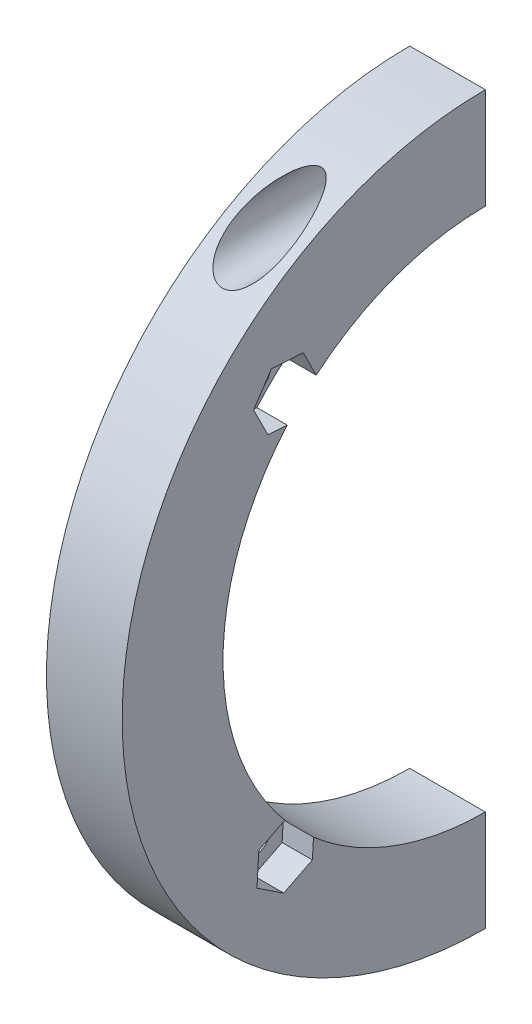
ISO-10303-21;
HEADER;
FILE_DESCRIPTION(('STEP AP214'),'2;1');
FILE_NAME('part.step','',(''),(''),'','','');
FILE_SCHEMA(('AUTOMOTIVE_DESIGN { 1 0 10303 214 1 1 1 1 }'));
ENDSEC;
DATA;
#1=APPLICATION_CONTEXT('core data for automotive mechanical design processes');
#2=APPLICATION_PROTOCOL_DEFINITION('international standard','automotive_design',2000,#1);
#3=PRODUCT_CONTEXT('',#1,'mechanical');
#4=PRODUCT('Part','Part','',(#3));
#5=PRODUCT_RELATED_PRODUCT_CATEGORY('part','',(#4));
#6=PRODUCT_DEFINITION_FORMATION('','',#4);
#7=PRODUCT_DEFINITION_CONTEXT('part definition',#1,'design');
#8=PRODUCT_DEFINITION('design','',#6,#7);
#9=PRODUCT_DEFINITION_SHAPE('','',#8);
#10=(LENGTH_UNIT() NAMED_UNIT(*) SI_UNIT(.MILLI.,.METRE.));
#11=(NAMED_UNIT(*) PLANE_ANGLE_UNIT() SI_UNIT($,.RADIAN.));
#12=(NAMED_UNIT(*) SI_UNIT($,.STERADIAN.) SOLID_ANGLE_UNIT());
#13=UNCERTAINTY_MEASURE_WITH_UNIT(LENGTH_MEASURE(1.E-05),#10,'distance_accuracy_value','');
#14=(GEOMETRIC_REPRESENTATION_CONTEXT(3) GLOBAL_UNCERTAINTY_ASSIGNED_CONTEXT((#13)) GLOBAL_UNIT_ASSIGNED_CONTEXT((#10,
#11,#12)) REPRESENTATION_CONTEXT('',''));
#15=CARTESIAN_POINT('',(0.,0.,0.));
#16=DIRECTION('',(0.,0.,1.));
#17=DIRECTION('',(1.,0.,0.));
#18=AXIS2_PLACEMENT_3D('',#15,#16,#17);
#19=CARTESIAN_POINT('',(-3.75,-19.798989873223,19.7989898732236));
#20=DIRECTION('',(1.,0.,0.));
#21=DIRECTION('',(0.,0.,-1.));
#22=AXIS2_PLACEMENT_3D('',#19,#20,#21);
#23=CYLINDRICAL_SURFACE('',#22,1.5);
#24=CARTESIAN_POINT('',(-3.75,-19.798989873223,19.7989898732236));
#25=DIRECTION('',(1.,0.,0.));
#26=DIRECTION('',(0.,0.,-1.));
#27=AXIS2_PLACEMENT_3D('',#24,#25,#26);
#28=CIRCLE('',#27,1.5);
#29=CARTESIAN_POINT('',(-3.75,-19.798989873223,18.2989898732236));
#30=VERTEX_POINT('',#29);
#31=EDGE_CURVE('E395',#30,#30,#28,.T.);
#32=ORIENTED_EDGE('',*,*,#31,.F.);
#33=EDGE_LOOP('',(#32));
#34=FACE_BOUND('',#33,.T.);
#35=CARTESIAN_POINT('',(0.75,-19.798989873223,19.7989898732236));
#36=DIRECTION('',(1.,0.,0.));
#37=DIRECTION('',(0.,0.,-1.));
#38=AXIS2_PLACEMENT_3D('',#35,#36,#37);
#39=CIRCLE('',#38,1.5);
#40=CARTESIAN_POINT('',(0.75,-19.798989873223,18.2989898732236));
#41=VERTEX_POINT('',#40);
#42=EDGE_CURVE('E312',#41,#41,#39,.F.);
#43=ORIENTED_EDGE('',*,*,#42,.F.);
#44=EDGE_LOOP('',(#43));
#45=FACE_BOUND('',#44,.T.);
#46=ADVANCED_FACE('F47',(#34,#45),#23,.F.);
#47=CARTESIAN_POINT('',(-3.75,19.7989898732234,19.7989898732232));
#48=DIRECTION('',(1.,0.,0.));
#49=DIRECTION('',(0.,0.,-1.));
#50=AXIS2_PLACEMENT_3D('',#47,#48,#49);
#51=CYLINDRICAL_SURFACE('',#50,1.5);
#52=CARTESIAN_POINT('',(-3.75,19.7989898732234,19.7989898732232));
#53=DIRECTION('',(1.,0.,0.));
#54=DIRECTION('',(0.,0.,-1.));
#55=AXIS2_PLACEMENT_3D('',#52,#53,#54);
#56=CIRCLE('',#55,1.5);
#57=CARTESIAN_POINT('',(-3.75,19.7989898732234,18.2989898732232));
#58=VERTEX_POINT('',#57);
#59=EDGE_CURVE('E391',#58,#58,#56,.T.);
#60=ORIENTED_EDGE('',*,*,#59,.F.);
#61=EDGE_LOOP('',(#60));
#62=FACE_BOUND('',#61,.T.);
#63=CARTESIAN_POINT('',(0.75,19.7989898732234,19.7989898732232));
#64=DIRECTION('',(1.,0.,0.));
#65=DIRECTION('',(0.,0.,-1.));
#66=AXIS2_PLACEMENT_3D('',#63,#64,#65);
#67=CIRCLE('',#66,1.5);
#68=CARTESIAN_POINT('',(0.75,19.7989898732234,18.2989898732232));
#69=VERTEX_POINT('',#68);
#70=EDGE_CURVE('E316',#69,#69,#67,.F.);
#71=ORIENTED_EDGE('',*,*,#70,.F.);
#72=EDGE_LOOP('',(#71));
#73=FACE_BOUND('',#72,.T.);
#74=ADVANCED_FACE('F49',(#62,#73),#51,.F.);
#75=CARTESIAN_POINT('',(-3.75,0.,0.));
#76=DIRECTION('',(1.,0.,0.));
#77=DIRECTION('',(0.,0.,-1.));
#78=AXIS2_PLACEMENT_3D('',#75,#76,#77);
#79=CYLINDRICAL_SURFACE('',#78,36.);
#80=CARTESIAN_POINT('',(2.75,31.,18.3030052177231));
#81=CARTESIAN_POINT('',(2.74999466553187,30.8809195994371,18.5046948435678));
#82=CARTESIAN_POINT('',(2.7422882492766,30.7598697234594,18.7052147501782));
#83=CARTESIAN_POINT('',(2.70962562496239,30.5144339749249,19.1029815337255));
#84=CARTESIAN_POINT('',(2.68466197240321,30.3900466849274,19.3002269604851));
#85=CARTESIAN_POINT('',(2.61523874007032,30.1399012461805,19.6885586811282));
#86=CARTESIAN_POINT('',(2.57090979045198,30.0141576957928,19.879677188847));
#87=CARTESIAN_POINT('',(2.45958499100969,29.7623040799162,20.2547795539056));
#88=CARTESIAN_POINT('',(2.39262119417604,29.6361947813477,20.4387730924508));
#89=CARTESIAN_POINT('',(2.25177701681849,29.4174605616639,20.7518653513768));
#90=CARTESIAN_POINT('',(2.18377086341621,29.3243170609108,20.8832249380609));
#91=CARTESIAN_POINT('',(2.03012832436001,29.1411315285388,21.1380949021695));
#92=CARTESIAN_POINT('',(1.94446754674997,29.0510939912632,21.2615941072322));
#93=CARTESIAN_POINT('',(1.75199398154881,28.8762932374525,21.498408359328));
#94=CARTESIAN_POINT('',(1.64496160571443,28.7915979116163,21.6115982541552));
#95=CARTESIAN_POINT('',(1.40797628030701,28.6335172793744,21.8206034622439));
#96=CARTESIAN_POINT('',(1.27809685906129,28.5600970651,21.916472570469));
#97=CARTESIAN_POINT('',(1.04795069920218,28.4556396982686,22.0517796632991));
#98=CARTESIAN_POINT('',(0.954756989760834,28.4190175132875,22.0989173580897));
#99=CARTESIAN_POINT('',(0.760025265316409,28.3551311820991,22.1808301561303));
#100=CARTESIAN_POINT('',(0.658493491499862,28.3278601141417,22.2156144041563));
#101=CARTESIAN_POINT('',(0.448197489697747,28.2846325242262,22.2706270406836));
#102=CARTESIAN_POINT('',(0.339379464809641,28.2687734129042,22.2907301343229));
#103=CARTESIAN_POINT('',(0.118843772232718,28.2503478706858,22.3140782309497));
#104=CARTESIAN_POINT('',(0.00712809296340625,28.2477725547126,22.3173345022053));
#105=CARTESIAN_POINT('',(-0.201948143396671,28.2556644290179,22.3073404673802));
#106=CARTESIAN_POINT('',(-0.299464793384327,28.2646470714369,22.295969044286));
#107=CARTESIAN_POINT('',(-0.490743092329955,28.2924151648327,22.260721937491));
#108=CARTESIAN_POINT('',(-0.584503940860179,28.3112026935618,22.2368436034482));
#109=CARTESIAN_POINT('',(-0.768070996021517,28.357705012101,22.1775110497067));
#110=CARTESIAN_POINT('',(-0.857760531598754,28.3855909104996,22.1418347618104));
#111=CARTESIAN_POINT('',(-1.02997247112403,28.4485147697325,22.0609302143391));
#112=CARTESIAN_POINT('',(-1.11249174347176,28.4835558334135,22.0156978104462));
#113=CARTESIAN_POINT('',(-1.31847350562702,28.5825504391979,21.8871597791224));
#114=CARTESIAN_POINT('',(-1.43584527705388,28.6510176887974,21.797564551668));
#115=CARTESIAN_POINT('',(-1.65149635713771,28.7972439529883,21.6040164638934));
#116=CARTESIAN_POINT('',(-1.74972005924454,28.8750290009295,21.500023244138));
#117=CARTESIAN_POINT('',(-1.90972074092152,29.0189804929197,21.3051687867676));
#118=CARTESIAN_POINT('',(-1.97480884412348,29.0841099505177,21.2162034680838));
#119=CARTESIAN_POINT('',(-2.09522534570123,29.2165898858383,21.0333929630066));
#120=CARTESIAN_POINT('',(-2.15054799498631,29.2839416443604,20.9395449438942));
#121=CARTESIAN_POINT('',(-2.25238884267785,29.4199777727334,20.7479813091463));
#122=CARTESIAN_POINT('',(-2.29889778114697,29.4886634614627,20.6502617548211));
#123=CARTESIAN_POINT('',(-2.38390024140074,29.6266523829455,20.451799417718));
#124=CARTESIAN_POINT('',(-2.42239094948564,29.6959558236099,20.3510555878238));
#125=CARTESIAN_POINT('',(-2.51637627649227,29.8829856315124,20.076126390907));
#126=CARTESIAN_POINT('',(-2.56504107030081,30.0008176531385,19.8996624021695));
#127=CARTESIAN_POINT('',(-2.64438324639875,30.2351250127371,19.5418285849918));
#128=CARTESIAN_POINT('',(-2.67504811245636,30.3515993516167,19.3604554344302));
#129=CARTESIAN_POINT('',(-2.72064892529054,30.5823549051369,18.9938561727861));
#130=CARTESIAN_POINT('',(-2.73555083956489,30.6966308536583,18.8086226019841));
#131=CARTESIAN_POINT('',(-2.75121187517669,30.9220098459233,18.4357476883448));
#132=CARTESIAN_POINT('',(-2.75197376409792,31.0331135063185,18.2481068238747));
#133=CARTESIAN_POINT('',(-2.73798974622542,31.3029768107923,17.7827442020635));
#134=CARTESIAN_POINT('',(-2.71580657972275,31.4596607750545,17.5040297415852));
#135=CARTESIAN_POINT('',(-2.64625488441352,31.7643886082268,16.9447667492797));
#136=CARTESIAN_POINT('',(-2.59886574856877,31.9124252975327,16.6642169025668));
#137=CARTESIAN_POINT('',(-2.50946192512619,32.1274367343815,16.2435433640109));
#138=CARTESIAN_POINT('',(-2.47657715312869,32.197981295409,16.1032435851626));
#139=CARTESIAN_POINT('',(-2.40459653005305,32.3366081139273,15.8230272552031));
#140=CARTESIAN_POINT('',(-2.36550136074867,32.4046906406929,15.6831106637387));
#141=CARTESIAN_POINT('',(-2.28091749074846,32.5382316928708,15.4041349330311));
#142=CARTESIAN_POINT('',(-2.23543499241027,32.6036926855775,15.2650750969859));
#143=CARTESIAN_POINT('',(-2.13762747038432,32.7319219054392,14.9881473102075));
#144=CARTESIAN_POINT('',(-2.08530376245422,32.7946906473149,14.850279135706));
#145=CARTESIAN_POINT('',(-1.97488736567009,32.9154110764976,14.5807003657261));
#146=CARTESIAN_POINT('',(-1.91703142880864,32.9734525068127,14.4489334882183));
#147=CARTESIAN_POINT('',(-1.79318219857299,33.0866355299881,14.1878395241279));
#148=CARTESIAN_POINT('',(-1.7271835542618,33.1417751816481,14.0585141069831));
#149=CARTESIAN_POINT('',(-1.58582785450616,33.2484361418842,13.8043615670858));
#150=CARTESIAN_POINT('',(-1.51051475901283,33.299972776412,13.6795166501701));
#151=CARTESIAN_POINT('',(-1.34794343911214,33.3988799152397,13.4362177117029));
#152=CARTESIAN_POINT('',(-1.26070666938655,33.4462576568734,13.3177527324466));
#153=CARTESIAN_POINT('',(-1.09349510545466,33.5244962683431,13.1193228493603));
#154=CARTESIAN_POINT('',(-1.01691890604078,33.5565709011348,13.037004194415));
#155=CARTESIAN_POINT('',(-0.852261585647131,33.6160652073202,12.8828136836897));
#156=CARTESIAN_POINT('',(-0.764219623140296,33.6435000252941,12.8109079545904));
#157=CARTESIAN_POINT('',(-0.615581335740099,33.6807834825855,12.712446964838));
#158=CARTESIAN_POINT('',(-0.559704725040065,33.6930909062049,12.6797702010805));
#159=CARTESIAN_POINT('',(-0.443433621741538,33.7146547869986,12.6223210281926));
#160=CARTESIAN_POINT('',(-0.383044989586,33.7239151201792,12.5975385785082));
#161=CARTESIAN_POINT('',(-0.267541090296912,33.7374786836096,12.561164741275));
#162=CARTESIAN_POINT('',(-0.212934827678291,33.7423067302276,12.5481797581885));
#163=CARTESIAN_POINT('',(-0.102168069599653,33.7486595038341,12.5310841249729));
#164=CARTESIAN_POINT('',(-0.046009133729449,33.7501874317002,12.5269648757339));
#165=CARTESIAN_POINT('',(0.0662690311642557,33.7497752537511,12.5280752851181));
#166=CARTESIAN_POINT('',(0.12238813000064,33.7478309509692,12.533316257662));
#167=CARTESIAN_POINT('',(0.232892192362426,33.740682136944,12.5525483135904));
#168=CARTESIAN_POINT('',(0.287275357415297,33.7354743529447,12.5665481807391));
#169=CARTESIAN_POINT('',(0.411109852538368,33.720035237428,12.6079282292491));
#170=CARTESIAN_POINT('',(0.479432099275006,33.7087002710061,12.6382332076378));
#171=CARTESIAN_POINT('',(0.610156054697661,33.6822920123698,12.7084462400637));
#172=CARTESIAN_POINT('',(0.672542382436872,33.6672093555054,12.7483783426075));
#173=CARTESIAN_POINT('',(0.784388190554286,33.6363187625145,12.8296421653554));
#174=CARTESIAN_POINT('',(0.834497691086957,33.6208208698108,12.8702161953879));
#175=CARTESIAN_POINT('',(0.930824596521608,33.588174927869,12.9551760357163));
#176=CARTESIAN_POINT('',(0.977038742465084,33.5710255221298,12.9995649761853));
#177=CARTESIAN_POINT('',(1.11070675959238,33.5175571552255,13.1370844384624));
#178=CARTESIAN_POINT('',(1.19301411705145,33.4792689472768,13.2344329087903));
#179=CARTESIAN_POINT('',(1.3573716403185,33.3936832738202,13.4490542649141));
#180=CARTESIAN_POINT('',(1.43790217037031,33.3458664817948,13.5672470193747));
#181=CARTESIAN_POINT('',(1.58854772853948,33.2465839494931,13.8087560788486));
#182=CARTESIAN_POINT('',(1.65865031368277,33.1951139565185,13.9320782836014));
#183=CARTESIAN_POINT('',(1.79043919835108,33.0890174074057,14.182222872959));
#184=CARTESIAN_POINT('',(1.85210390299916,33.0343832431913,14.3090532753858));
#185=CARTESIAN_POINT('',(1.96805609926324,32.9224308254744,14.5647874443903));
#186=CARTESIAN_POINT('',(2.02234647746568,32.8651136340911,14.6936903774765));
#187=CARTESIAN_POINT('',(2.12955960240086,32.742064964797,14.9660183642221));
#188=CARTESIAN_POINT('',(2.18179026506147,32.6760683718,15.1095950851793));
#189=CARTESIAN_POINT('',(2.2790454612574,32.5412200246151,15.3978678415298));
#190=CARTESIAN_POINT('',(2.32406856018338,32.4723677054425,15.5425640937637));
#191=CARTESIAN_POINT('',(2.40733665495178,32.3318799113134,15.8327365556797));
#192=CARTESIAN_POINT('',(2.44557508281535,32.2602418204492,15.9782133821946));
#193=CARTESIAN_POINT('',(2.51540488532157,32.1143481978206,16.2694556806134));
#194=CARTESIAN_POINT('',(2.54699550600952,32.0400923702819,16.4152211833669));
#195=CARTESIAN_POINT('',(2.63195764259192,31.8132937325403,16.8529631737645));
#196=CARTESIAN_POINT('',(2.67539778487801,31.6569262885654,17.1449578447062));
#197=CARTESIAN_POINT('',(2.73441013022167,31.3350305464818,17.7264254693992));
#198=CARTESIAN_POINT('',(2.75000759360385,31.1695106926463,18.0159004715609));
#199=CARTESIAN_POINT('',(2.75,31.,18.3030052177231));
#200=B_SPLINE_CURVE_WITH_KNOTS('',3,(#80,#81,#82,#83,#84,#85,#86,#87,#88,#89,#90,#91,#92,#93,
#94,#95,#96,#97,#98,#99,#100,#101,#102,#103,#104,#105,#106,#107,#108,#109,#110,#111,#112,#113,
#114,#115,#116,#117,#118,#119,#120,#121,#122,#123,#124,#125,#126,#127,#128,#129,#130,#131,#132,
#133,#134,#135,#136,#137,#138,#139,#140,#141,#142,#143,#144,#145,#146,#147,#148,#149,#150,#151,
#152,#153,#154,#155,#156,#157,#158,#159,#160,#161,#162,#163,#164,#165,#166,#167,#168,#169,#170,
#171,#172,#173,#174,#175,#176,#177,#178,#179,#180,#181,#182,#183,#184,#185,#186,#187,#188,#189,
#190,#191,#192,#193,#194,#195,#196,#197,#198,#199),.UNSPECIFIED.,.T.,.F.,(4,2,2,2,2,2,2,2,2,2,2,
2,2,2,2,2,2,2,2,2,2,2,2,2,2,2,2,2,2,2,2,2,2,2,2,2,2,2,2,2,2,2,2,2,2,2,2,2,2,2,2,2,2,2,2,2,2,2,2,
4),(0.,0.702480304085621,1.40526383638097,2.1033781723239,2.80050802828029,3.32404951303195,
3.84831924059311,4.37828199965367,4.90656939068882,5.23742475779953,5.56803469252903,
5.90143422407533,6.23461072712598,6.52897086315514,6.82339340234988,7.12370721493075,
7.42415153662387,7.90966613309496,8.39657033435253,8.78015611066646,9.16396696278526,
9.5481788487284,9.93252533326884,10.5845768597687,11.2370812541831,11.8909915599561,
12.5447738765216,13.5050397564324,14.466091907233,14.9473080666937,15.4284714349883,
15.9091707637643,16.3897777761179,16.8550810667771,17.3206917741463,17.784183352332,
18.2468516714817,18.5969335612984,18.9458497384947,19.1429957116348,19.339889929868,
19.5081706996729,19.6762881758145,19.8446089970589,20.0130988882113,20.2386095264367,
20.4646894347379,20.6633383476866,20.8621518393356,21.2604452056494,21.712239326836,
22.1645682925011,22.6180340661672,23.071321821715,23.5703966804595,24.0695707529816,
24.5692254510611,25.0689367864955,26.0698244997182,27.069803693213),.UNSPECIFIED.);
#201=CARTESIAN_POINT('',(2.75,31.,18.3030052177231));
#202=VERTEX_POINT('',#201);
#203=EDGE_CURVE('E373',#202,#202,#200,.T.);
#204=ORIENTED_EDGE('',*,*,#203,.T.);
#205=EDGE_LOOP('',(#204));
#206=FACE_BOUND('',#205,.T.);
#207=DIRECTION('',(1.,0.,0.));
#208=VECTOR('',#207,1.);
#209=CARTESIAN_POINT('',(-3.75,-36.,0.));
#210=LINE('',#209,#208);
#211=CARTESIAN_POINT('',(-3.75,-36.,0.));
#212=VERTEX_POINT('',#211);
#213=CARTESIAN_POINT('',(3.75,-36.,0.));
#214=VERTEX_POINT('',#213);
#215=EDGE_CURVE('E411',#212,#214,#210,.T.);
#216=ORIENTED_EDGE('',*,*,#215,.T.);
#217=CARTESIAN_POINT('',(3.75,0.,0.));
#218=DIRECTION('',(1.,0.,0.));
#219=DIRECTION('',(0.,0.,-1.));
#220=AXIS2_PLACEMENT_3D('',#217,#218,#219);
#221=CIRCLE('',#220,36.);
#222=CARTESIAN_POINT('',(3.75,36.,0.));
#223=VERTEX_POINT('',#222);
#224=EDGE_CURVE('E387',#223,#214,#221,.T.);
#225=ORIENTED_EDGE('',*,*,#224,.F.);
#226=DIRECTION('',(1.,0.,0.));
#227=VECTOR('',#226,1.);
#228=CARTESIAN_POINT('',(-3.75,36.,0.));
#229=LINE('',#228,#227);
#230=CARTESIAN_POINT('',(-3.75,36.,0.));
#231=VERTEX_POINT('',#230);
#232=EDGE_CURVE('E415',#231,#223,#229,.T.);
#233=ORIENTED_EDGE('',*,*,#232,.F.);
#234=CARTESIAN_POINT('',(-3.75,0.,0.));
#235=DIRECTION('',(1.,0.,0.));
#236=DIRECTION('',(0.,0.,-1.));
#237=AXIS2_PLACEMENT_3D('',#234,#235,#236);
#238=CIRCLE('',#237,36.);
#239=EDGE_CURVE('E406',#231,#212,#238,.T.);
#240=ORIENTED_EDGE('',*,*,#239,.T.);
#241=EDGE_LOOP('',(#216,#225,#233,#240));
#242=FACE_BOUND('',#241,.T.);
#243=CARTESIAN_POINT('',(59.1935750346352,0.,0.));
#244=DIRECTION('',(-0.5,0.866025403784439,0.));
#245=DIRECTION('',(0.866025403784439,0.5,0.));
#246=AXIS2_PLACEMENT_3D('',#243,#244,#245);
#247=ELLIPSE('',#246,72.,36.);
#248=CARTESIAN_POINT('',(2.75,-32.5877132402715,15.2983968365916));
#249=VERTEX_POINT('',#248);
#250=CARTESIAN_POINT('',(0.,-34.1754264805429,11.3154860643723));
#251=VERTEX_POINT('',#250);
#252=EDGE_CURVE('E414',#249,#251,#247,.F.);
#253=ORIENTED_EDGE('',*,*,#252,.T.);
#254=CARTESIAN_POINT('',(-59.1935750346354,0.,0.));
#255=DIRECTION('',(0.499999999999999,0.866025403784439,0.));
#256=DIRECTION('',(0.866025403784439,-0.499999999999999,0.));
#257=AXIS2_PLACEMENT_3D('',#254,#255,#256);
#258=ELLIPSE('',#257,72.0000000000001,36.);
#259=CARTESIAN_POINT('',(-2.74999999999999,-32.5877132402715,15.2983968365916));
#260=VERTEX_POINT('',#259);
#261=EDGE_CURVE('E579',#251,#260,#258,.F.);
#262=ORIENTED_EDGE('',*,*,#261,.T.);
#263=CARTESIAN_POINT('',(-2.74999999999999,0.,0.));
#264=DIRECTION('',(1.,0.,0.));
#265=DIRECTION('',(0.,0.,-1.));
#266=AXIS2_PLACEMENT_3D('',#263,#264,#265);
#267=CIRCLE('',#266,36.);
#268=CARTESIAN_POINT('',(-2.74999999999999,-29.4122867597285,20.7585497461527));
#269=VERTEX_POINT('',#268);
#270=EDGE_CURVE('E592',#260,#269,#267,.F.);
#271=ORIENTED_EDGE('',*,*,#270,.T.);
#272=CARTESIAN_POINT('',(48.1935750346352,0.,0.));
#273=DIRECTION('',(0.5,-0.866025403784439,0.));
#274=DIRECTION('',(0.866025403784439,0.5,0.));
#275=AXIS2_PLACEMENT_3D('',#272,#273,#274);
#276=ELLIPSE('',#275,72.,36.);
#277=CARTESIAN_POINT('',(0.,-27.8245735194571,22.8427911705275));
#278=VERTEX_POINT('',#277);
#279=EDGE_CURVE('E589',#269,#278,#276,.F.);
#280=ORIENTED_EDGE('',*,*,#279,.T.);
#281=CARTESIAN_POINT('',(-48.1935750346353,0.,0.));
#282=DIRECTION('',(-0.499999999999999,-0.866025403784439,0.));
#283=DIRECTION('',(0.866025403784439,-0.499999999999999,0.));
#284=AXIS2_PLACEMENT_3D('',#281,#282,#283);
#285=ELLIPSE('',#284,72.0000000000001,36.);
#286=CARTESIAN_POINT('',(2.75,-29.4122867597285,20.7585497461527));
#287=VERTEX_POINT('',#286);
#288=EDGE_CURVE('E593',#278,#287,#285,.F.);
#289=ORIENTED_EDGE('',*,*,#288,.T.);
#290=CARTESIAN_POINT('',(2.75,0.,0.));
#291=DIRECTION('',(-1.,0.,0.));
#292=DIRECTION('',(0.,0.,1.));
#293=AXIS2_PLACEMENT_3D('',#290,#291,#292);
#294=CIRCLE('',#293,36.);
#295=EDGE_CURVE('E598',#287,#249,#294,.F.);
#296=ORIENTED_EDGE('',*,*,#295,.T.);
#297=EDGE_LOOP('',(#253,#262,#271,#280,#289,#296));
#298=FACE_BOUND('',#297,.T.);
#299=ADVANCED_FACE('F436',(#206,#242,#298),#79,.T.);
#300=CARTESIAN_POINT('',(-3.75,0.,0.));
#301=DIRECTION('',(0.,0.,1.));
#302=DIRECTION('',(0.,-1.,0.));
#303=AXIS2_PLACEMENT_3D('',#300,#301,#302);
#304=PLANE('',#303);
#305=CARTESIAN_POINT('',(0.,-31.,0.));
#306=DIRECTION('',(0.,0.,1.));
#307=DIRECTION('',(-1.,0.,0.));
#308=AXIS2_PLACEMENT_3D('',#305,#306,#307);
#309=CIRCLE('',#308,1.5);
#310=CARTESIAN_POINT('',(-1.5,-31.,0.));
#311=VERTEX_POINT('',#310);
#312=EDGE_CURVE('E368',#311,#311,#309,.T.);
#313=ORIENTED_EDGE('',*,*,#312,.T.);
#314=EDGE_LOOP('',(#313));
#315=FACE_BOUND('',#314,.T.);
#316=DIRECTION('',(1.,0.,0.));
#317=VECTOR('',#316,1.);
#318=CARTESIAN_POINT('',(-3.75,-26.,0.));
#319=LINE('',#318,#317);
#320=CARTESIAN_POINT('',(-3.75,-26.,0.));
#321=VERTEX_POINT('',#320);
#322=CARTESIAN_POINT('',(3.75,-26.,0.));
#323=VERTEX_POINT('',#322);
#324=EDGE_CURVE('E410',#321,#323,#319,.T.);
#325=ORIENTED_EDGE('',*,*,#324,.T.);
#326=DIRECTION('',(0.,-1.,0.));
#327=VECTOR('',#326,1.);
#328=CARTESIAN_POINT('',(3.75,0.,0.));
#329=LINE('',#328,#327);
#330=EDGE_CURVE('E377',#323,#214,#329,.T.);
#331=ORIENTED_EDGE('',*,*,#330,.T.);
#332=ORIENTED_EDGE('',*,*,#215,.F.);
#333=DIRECTION('',(0.,-1.,0.));
#334=VECTOR('',#333,1.);
#335=CARTESIAN_POINT('',(-3.75,0.,0.));
#336=LINE('',#335,#334);
#337=EDGE_CURVE('E399',#321,#212,#336,.T.);
#338=ORIENTED_EDGE('',*,*,#337,.F.);
#339=EDGE_LOOP('',(#325,#331,#332,#338));
#340=FACE_BOUND('',#339,.T.);
#341=ADVANCED_FACE('F479',(#315,#340),#304,.F.);
#342=CARTESIAN_POINT('',(0.,31.,0.));
#343=DIRECTION('',(0.,0.,-1.));
#344=DIRECTION('',(-1.,0.,0.));
#345=AXIS2_PLACEMENT_3D('',#342,#343,#344);
#346=CIRCLE('',#345,1.5);
#347=CARTESIAN_POINT('',(-1.5,31.,0.));
#348=VERTEX_POINT('',#347);
#349=EDGE_CURVE('E372',#348,#348,#346,.T.);
#350=ORIENTED_EDGE('',*,*,#349,.F.);
#351=EDGE_LOOP('',(#350));
#352=FACE_BOUND('',#351,.T.);
#353=ORIENTED_EDGE('',*,*,#232,.T.);
#354=CARTESIAN_POINT('',(3.75,26.,0.));
#355=VERTEX_POINT('',#354);
#356=EDGE_CURVE('E382',#223,#355,#329,.T.);
#357=ORIENTED_EDGE('',*,*,#356,.T.);
#358=DIRECTION('',(1.,0.,0.));
#359=VECTOR('',#358,1.);
#360=CARTESIAN_POINT('',(-3.75,26.,0.));
#361=LINE('',#360,#359);
#362=CARTESIAN_POINT('',(-3.75,26.,0.));
#363=VERTEX_POINT('',#362);
#364=EDGE_CURVE('E418',#363,#355,#361,.T.);
#365=ORIENTED_EDGE('',*,*,#364,.F.);
#366=EDGE_CURVE('E403',#231,#363,#336,.T.);
#367=ORIENTED_EDGE('',*,*,#366,.F.);
#368=EDGE_LOOP('',(#353,#357,#365,#367));
#369=FACE_BOUND('',#368,.T.);
#370=ADVANCED_FACE('F466',(#352,#369),#304,.F.);
#371=CARTESIAN_POINT('',(-3.75,0.,0.));
#372=DIRECTION('',(1.,0.,0.));
#373=DIRECTION('',(0.,0.,-1.));
#374=AXIS2_PLACEMENT_3D('',#371,#372,#373);
#375=CYLINDRICAL_SURFACE('',#374,26.);
#376=CARTESIAN_POINT('',(3.75,0.,0.));
#377=DIRECTION('',(1.,0.,0.));
#378=DIRECTION('',(0.,0.,-1.));
#379=AXIS2_PLACEMENT_3D('',#376,#377,#378);
#380=CIRCLE('',#379,26.);
#381=CARTESIAN_POINT('',(3.75,19.8767285110187,16.7605388845126));
#382=VERTEX_POINT('',#381);
#383=EDGE_CURVE('E383',#355,#382,#380,.T.);
#384=ORIENTED_EDGE('',*,*,#383,.T.);
#385=DIRECTION('',(1.,0.,0.));
#386=VECTOR('',#385,1.);
#387=CARTESIAN_POINT('',(-3.75,19.8767285110187,16.7605388845126));
#388=LINE('',#387,#386);
#389=CARTESIAN_POINT('',(0.75,19.8767285110187,16.7605388845125));
#390=VERTEX_POINT('',#389);
#391=EDGE_CURVE('E308',#382,#390,#388,.F.);
#392=ORIENTED_EDGE('',*,*,#391,.T.);
#393=CARTESIAN_POINT('',(0.75,0.,0.));
#394=DIRECTION('',(1.,0.,0.));
#395=DIRECTION('',(0.,0.,-1.));
#396=AXIS2_PLACEMENT_3D('',#393,#394,#395);
#397=CIRCLE('',#396,26.);
#398=CARTESIAN_POINT('',(0.75,17.035212346623,19.6418313887851));
#399=VERTEX_POINT('',#398);
#400=EDGE_CURVE('E11',#399,#390,#397,.F.);
#401=ORIENTED_EDGE('',*,*,#400,.F.);
#402=DIRECTION('',(1.,0.,0.));
#403=VECTOR('',#402,1.);
#404=CARTESIAN_POINT('',(-3.75,17.035212346623,19.6418313887851));
#405=LINE('',#404,#403);
#406=CARTESIAN_POINT('',(3.75,17.035212346623,19.6418313887851));
#407=VERTEX_POINT('',#406);
#408=EDGE_CURVE('E305',#399,#407,#405,.T.);
#409=ORIENTED_EDGE('',*,*,#408,.T.);
#410=CARTESIAN_POINT('',(3.75,-16.7605388845126,19.8767285110187));
#411=VERTEX_POINT('',#410);
#412=EDGE_CURVE('E227',#407,#411,#380,.T.);
#413=ORIENTED_EDGE('',*,*,#412,.T.);
#414=DIRECTION('',(1.,0.,0.));
#415=VECTOR('',#414,1.);
#416=CARTESIAN_POINT('',(-3.75,-16.7605388845126,19.8767285110187));
#417=LINE('',#416,#415);
#418=CARTESIAN_POINT('',(0.75,-16.7605388845125,19.8767285110187));
#419=VERTEX_POINT('',#418);
#420=EDGE_CURVE('E301',#411,#419,#417,.F.);
#421=ORIENTED_EDGE('',*,*,#420,.T.);
#422=CARTESIAN_POINT('',(0.75,0.,0.));
#423=DIRECTION('',(1.,0.,0.));
#424=DIRECTION('',(0.,0.,-1.));
#425=AXIS2_PLACEMENT_3D('',#422,#423,#424);
#426=CIRCLE('',#425,26.);
#427=CARTESIAN_POINT('',(0.75,-19.6418313887851,17.035212346623));
#428=VERTEX_POINT('',#427);
#429=EDGE_CURVE('E56',#428,#419,#426,.F.);
#430=ORIENTED_EDGE('',*,*,#429,.F.);
#431=DIRECTION('',(1.,0.,0.));
#432=VECTOR('',#431,1.);
#433=CARTESIAN_POINT('',(-3.75,-19.6418313887851,17.035212346623));
#434=LINE('',#433,#432);
#435=CARTESIAN_POINT('',(3.75,-19.6418313887851,17.035212346623));
#436=VERTEX_POINT('',#435);
#437=EDGE_CURVE('E289',#428,#436,#434,.T.);
#438=ORIENTED_EDGE('',*,*,#437,.T.);
#439=EDGE_CURVE('E381',#436,#323,#380,.T.);
#440=ORIENTED_EDGE('',*,*,#439,.T.);
#441=ORIENTED_EDGE('',*,*,#324,.F.);
#442=CARTESIAN_POINT('',(-3.75,0.,0.));
#443=DIRECTION('',(1.,0.,0.));
#444=DIRECTION('',(0.,0.,-1.));
#445=AXIS2_PLACEMENT_3D('',#442,#443,#444);
#446=CIRCLE('',#445,26.);
#447=EDGE_CURVE('E402',#363,#321,#446,.T.);
#448=ORIENTED_EDGE('',*,*,#447,.F.);
#449=ORIENTED_EDGE('',*,*,#364,.T.);
#450=EDGE_LOOP('',(#384,#392,#401,#409,#413,#421,#430,#438,#440,#441,#448,#449));
#451=FACE_BOUND('',#450,.T.);
#452=ADVANCED_FACE('F460',(#451),#375,.F.);
#453=CARTESIAN_POINT('',(-3.75,0.,0.));
#454=DIRECTION('',(1.,0.,0.));
#455=DIRECTION('',(0.,0.,-1.));
#456=AXIS2_PLACEMENT_3D('',#453,#454,#455);
#457=PLANE('',#456);
#458=ORIENTED_EDGE('',*,*,#59,.T.);
#459=EDGE_LOOP('',(#458));
#460=FACE_BOUND('',#459,.T.);
#461=ORIENTED_EDGE('',*,*,#31,.T.);
#462=EDGE_LOOP('',(#461));
#463=FACE_BOUND('',#462,.T.);
#464=ORIENTED_EDGE('',*,*,#337,.T.);
#465=ORIENTED_EDGE('',*,*,#239,.F.);
#466=ORIENTED_EDGE('',*,*,#366,.T.);
#467=ORIENTED_EDGE('',*,*,#447,.T.);
#468=EDGE_LOOP('',(#464,#465,#466,#467));
#469=FACE_BOUND('',#468,.T.);
#470=ADVANCED_FACE('F458',(#460,#463,#469),#457,.F.);
#471=CARTESIAN_POINT('',(3.75,0.,0.));
#472=DIRECTION('',(1.,0.,0.));
#473=DIRECTION('',(0.,0.,-1.));
#474=AXIS2_PLACEMENT_3D('',#471,#472,#473);
#475=PLANE('',#474);
#476=DIRECTION('',(0.,0.893581311358818,0.448901370002649));
#477=VECTOR('',#476,1.);
#478=CARTESIAN_POINT('',(3.75,-2.71774480434872,5.4099321777392));
#479=LINE('',#478,#477);
#480=CARTESIAN_POINT('',(3.75,22.4522195200343,18.0543679157157));
#481=VERTEX_POINT('',#480);
#482=EDGE_CURVE('E607',#382,#481,#479,.T.);
#483=ORIENTED_EDGE('',*,*,#482,.F.);
#484=ORIENTED_EDGE('',*,*,#383,.F.);
#485=ORIENTED_EDGE('',*,*,#356,.F.);
#486=ORIENTED_EDGE('',*,*,#224,.T.);
#487=ORIENTED_EDGE('',*,*,#330,.F.);
#488=ORIENTED_EDGE('',*,*,#439,.F.);
#489=DIRECTION('',(0.,0.998314800985073,-0.0580306654634774));
#490=VECTOR('',#489,1.);
#491=CARTESIAN_POINT('',(3.75,-21.5436118307308,17.1457602264126));
#492=LINE('',#491,#490);
#493=CARTESIAN_POINT('',(3.75,-21.5436118307308,17.1457602264126));
#494=VERTEX_POINT('',#493);
#495=EDGE_CURVE('E258',#494,#436,#492,.T.);
#496=ORIENTED_EDGE('',*,*,#495,.F.);
#497=DIRECTION('',(0.,0.448901370002649,-0.893581311358818));
#498=VECTOR('',#497,1.);
#499=CARTESIAN_POINT('',(3.75,-22.9690651281892,19.9832619850197));
#500=LINE('',#499,#498);
#501=CARTESIAN_POINT('',(3.75,-22.9690651281892,19.9832619850197));
#502=VERTEX_POINT('',#501);
#503=EDGE_CURVE('E280',#502,#494,#500,.T.);
#504=ORIENTED_EDGE('',*,*,#503,.F.);
#505=DIRECTION('',(0.,-0.549413430982424,-0.835550645895341));
#506=VECTOR('',#505,1.);
#507=CARTESIAN_POINT('',(3.75,-21.2244431706816,22.6364916318305));
#508=LINE('',#507,#506);
#509=CARTESIAN_POINT('',(3.75,-21.2244431706816,22.6364916318305));
#510=VERTEX_POINT('',#509);
#511=EDGE_CURVE('E276',#510,#502,#508,.T.);
#512=ORIENTED_EDGE('',*,*,#511,.F.);
#513=DIRECTION('',(0.,-0.998314800985073,0.0580306654634774));
#514=VECTOR('',#513,1.);
#515=CARTESIAN_POINT('',(3.75,-18.0543679157157,22.4522195200343));
#516=LINE('',#515,#514);
#517=CARTESIAN_POINT('',(3.75,-18.0543679157157,22.4522195200343));
#518=VERTEX_POINT('',#517);
#519=EDGE_CURVE('E241',#518,#510,#516,.T.);
#520=ORIENTED_EDGE('',*,*,#519,.F.);
#521=DIRECTION('',(0.,-0.448901370002649,0.893581311358818));
#522=VECTOR('',#521,1.);
#523=CARTESIAN_POINT('',(3.75,-5.4099321777392,-2.71774480434872));
#524=LINE('',#523,#522);
#525=EDGE_CURVE('E604',#411,#518,#524,.T.);
#526=ORIENTED_EDGE('',*,*,#525,.F.);
#527=ORIENTED_EDGE('',*,*,#412,.F.);
#528=DIRECTION('',(0.,-0.0580306654634774,-0.998314800985073));
#529=VECTOR('',#528,1.);
#530=CARTESIAN_POINT('',(3.75,17.1457602264126,21.5436118307308));
#531=LINE('',#530,#529);
#532=CARTESIAN_POINT('',(3.75,17.1457602264126,21.5436118307308));
#533=VERTEX_POINT('',#532);
#534=EDGE_CURVE('E203',#533,#407,#531,.T.);
#535=ORIENTED_EDGE('',*,*,#534,.F.);
#536=DIRECTION('',(0.,-0.893581311358818,-0.448901370002649));
#537=VECTOR('',#536,1.);
#538=CARTESIAN_POINT('',(3.75,19.9832619850197,22.9690651281892));
#539=LINE('',#538,#537);
#540=CARTESIAN_POINT('',(3.75,19.9832619850197,22.9690651281892));
#541=VERTEX_POINT('',#540);
#542=EDGE_CURVE('E214',#541,#533,#539,.T.);
#543=ORIENTED_EDGE('',*,*,#542,.F.);
#544=DIRECTION('',(0.,-0.835550645895341,0.549413430982424));
#545=VECTOR('',#544,1.);
#546=CARTESIAN_POINT('',(3.75,22.6364916318305,21.2244431706816));
#547=LINE('',#546,#545);
#548=CARTESIAN_POINT('',(3.75,22.6364916318305,21.2244431706816));
#549=VERTEX_POINT('',#548);
#550=EDGE_CURVE('E220',#549,#541,#547,.T.);
#551=ORIENTED_EDGE('',*,*,#550,.F.);
#552=DIRECTION('',(0.,0.0580306654634774,0.998314800985073));
#553=VECTOR('',#552,1.);
#554=CARTESIAN_POINT('',(3.75,22.4522195200343,18.0543679157157));
#555=LINE('',#554,#553);
#556=EDGE_CURVE('E238',#481,#549,#555,.T.);
#557=ORIENTED_EDGE('',*,*,#556,.F.);
#558=EDGE_LOOP('',(#483,#484,#485,#486,#487,#488,#496,#504,#512,#520,#526,#527,#535,#543,#551,#557));
#559=FACE_BOUND('',#558,.T.);
#560=ADVANCED_FACE('F224',(#559),#475,.T.);
#561=CARTESIAN_POINT('',(0.,31.,25.5));
#562=DIRECTION('',(0.,0.,-1.));
#563=DIRECTION('',(-1.,0.,0.));
#564=AXIS2_PLACEMENT_3D('',#561,#562,#563);
#565=CYLINDRICAL_SURFACE('',#564,1.5);
#566=CARTESIAN_POINT('',(0.,31.,4.99999999999999));
#567=DIRECTION('',(0.,0.,-1.));
#568=DIRECTION('',(-1.,0.,0.));
#569=AXIS2_PLACEMENT_3D('',#566,#567,#568);
#570=CIRCLE('',#569,1.5);
#571=CARTESIAN_POINT('',(-1.5,31.,4.99999999999999));
#572=VERTEX_POINT('',#571);
#573=EDGE_CURVE('E367',#572,#572,#570,.F.);
#574=ORIENTED_EDGE('',*,*,#573,.T.);
#575=EDGE_LOOP('',(#574));
#576=FACE_BOUND('',#575,.T.);
#577=ORIENTED_EDGE('',*,*,#349,.T.);
#578=EDGE_LOOP('',(#577));
#579=FACE_BOUND('',#578,.T.);
#580=ADVANCED_FACE('F452',(#576,#579),#565,.F.);
#581=CARTESIAN_POINT('',(0.,-31.,25.5));
#582=DIRECTION('',(0.,0.,-1.));
#583=DIRECTION('',(-1.,0.,0.));
#584=AXIS2_PLACEMENT_3D('',#581,#582,#583);
#585=CYLINDRICAL_SURFACE('',#584,1.5);
#586=CARTESIAN_POINT('',(0.,-31.,4.99999999999999));
#587=DIRECTION('',(0.,0.,-1.));
#588=DIRECTION('',(-1.,0.,0.));
#589=AXIS2_PLACEMENT_3D('',#586,#587,#588);
#590=CIRCLE('',#589,1.5);
#591=CARTESIAN_POINT('',(-1.5,-31.,4.99999999999999));
#592=VERTEX_POINT('',#591);
#593=EDGE_CURVE('E362',#592,#592,#590,.T.);
#594=ORIENTED_EDGE('',*,*,#593,.F.);
#595=EDGE_LOOP('',(#594));
#596=FACE_BOUND('',#595,.T.);
#597=ORIENTED_EDGE('',*,*,#312,.F.);
#598=EDGE_LOOP('',(#597));
#599=FACE_BOUND('',#598,.T.);
#600=ADVANCED_FACE('F449',(#596,#599),#585,.F.);
#601=CARTESIAN_POINT('',(0.,31.,4.99999999999999));
#602=DIRECTION('',(0.,0.,-1.));
#603=DIRECTION('',(-1.,0.,0.));
#604=AXIS2_PLACEMENT_3D('',#601,#602,#603);
#605=PLANE('',#604);
#606=CARTESIAN_POINT('',(0.,31.,4.99999999999999));
#607=DIRECTION('',(0.,0.,-1.));
#608=DIRECTION('',(-1.,0.,0.));
#609=AXIS2_PLACEMENT_3D('',#606,#607,#608);
#610=CIRCLE('',#609,2.75);
#611=CARTESIAN_POINT('',(-2.75,31.,4.99999999999999));
#612=VERTEX_POINT('',#611);
#613=EDGE_CURVE('E363',#612,#612,#610,.T.);
#614=ORIENTED_EDGE('',*,*,#613,.F.);
#615=EDGE_LOOP('',(#614));
#616=FACE_BOUND('',#615,.T.);
#617=ORIENTED_EDGE('',*,*,#573,.F.);
#618=EDGE_LOOP('',(#617));
#619=FACE_BOUND('',#618,.T.);
#620=ADVANCED_FACE('F446',(#616,#619),#605,.F.);
#621=CARTESIAN_POINT('',(0.,31.,4.99999999999999));
#622=DIRECTION('',(0.,0.,1.));
#623=DIRECTION('',(1.,0.,0.));
#624=AXIS2_PLACEMENT_3D('',#621,#622,#623);
#625=CYLINDRICAL_SURFACE('',#624,2.75);
#626=ORIENTED_EDGE('',*,*,#203,.F.);
#627=EDGE_LOOP('',(#626));
#628=FACE_BOUND('',#627,.T.);
#629=ORIENTED_EDGE('',*,*,#613,.T.);
#630=EDGE_LOOP('',(#629));
#631=FACE_BOUND('',#630,.T.);
#632=ADVANCED_FACE('F440',(#628,#631),#625,.F.);
#633=CARTESIAN_POINT('',(0.,-34.1754264805429,4.99999999999999));
#634=DIRECTION('',(0.499999999999999,0.866025403784439,0.));
#635=DIRECTION('',(-0.866025403784439,0.499999999999999,0.));
#636=AXIS2_PLACEMENT_3D('',#633,#634,#635);
#637=PLANE('',#636);
#638=DIRECTION('',(0.,0.,1.));
#639=VECTOR('',#638,1.);
#640=CARTESIAN_POINT('',(0.,-34.1754264805429,4.99999999999999));
#641=LINE('',#640,#639);
#642=CARTESIAN_POINT('',(0.,-34.1754264805429,4.99999999999999));
#643=VERTEX_POINT('',#642);
#644=EDGE_CURVE('E339',#643,#251,#641,.T.);
#645=ORIENTED_EDGE('',*,*,#644,.F.);
#646=DIRECTION('',(-0.866025403784439,0.499999999999999,0.));
#647=VECTOR('',#646,1.);
#648=CARTESIAN_POINT('',(0.,-34.1754264805429,4.99999999999999));
#649=LINE('',#648,#647);
#650=CARTESIAN_POINT('',(-2.74999999999999,-32.5877132402715,4.99999999999999));
#651=VERTEX_POINT('',#650);
#652=EDGE_CURVE('E320',#643,#651,#649,.T.);
#653=ORIENTED_EDGE('',*,*,#652,.T.);
#654=DIRECTION('',(0.,0.,1.));
#655=VECTOR('',#654,1.);
#656=CARTESIAN_POINT('',(-2.74999999999999,-32.5877132402715,4.99999999999999));
#657=LINE('',#656,#655);
#658=EDGE_CURVE('E358',#651,#260,#657,.T.);
#659=ORIENTED_EDGE('',*,*,#658,.T.);
#660=ORIENTED_EDGE('',*,*,#261,.F.);
#661=EDGE_LOOP('',(#645,#653,#659,#660));
#662=FACE_BOUND('',#661,.T.);
#663=ADVANCED_FACE('F445',(#662),#637,.T.);
#664=CARTESIAN_POINT('',(-2.74999999999999,-32.5877132402715,4.99999999999999));
#665=DIRECTION('',(1.,0.,0.));
#666=DIRECTION('',(0.,0.,-1.));
#667=AXIS2_PLACEMENT_3D('',#664,#665,#666);
#668=PLANE('',#667);
#669=ORIENTED_EDGE('',*,*,#658,.F.);
#670=DIRECTION('',(0.,1.,0.));
#671=VECTOR('',#670,1.);
#672=CARTESIAN_POINT('',(-2.74999999999999,-32.5877132402715,4.99999999999999));
#673=LINE('',#672,#671);
#674=CARTESIAN_POINT('',(-2.74999999999999,-29.4122867597285,4.99999999999999));
#675=VERTEX_POINT('',#674);
#676=EDGE_CURVE('E324',#651,#675,#673,.T.);
#677=ORIENTED_EDGE('',*,*,#676,.T.);
#678=DIRECTION('',(0.,0.,1.));
#679=VECTOR('',#678,1.);
#680=CARTESIAN_POINT('',(-2.74999999999999,-29.4122867597285,4.99999999999999));
#681=LINE('',#680,#679);
#682=EDGE_CURVE('E354',#675,#269,#681,.T.);
#683=ORIENTED_EDGE('',*,*,#682,.T.);
#684=ORIENTED_EDGE('',*,*,#270,.F.);
#685=EDGE_LOOP('',(#669,#677,#683,#684));
#686=FACE_BOUND('',#685,.T.);
#687=ADVANCED_FACE('F566',(#686),#668,.T.);
#688=CARTESIAN_POINT('',(-2.74999999999999,-29.4122867597285,4.99999999999999));
#689=DIRECTION('',(0.5,-0.866025403784439,0.));
#690=DIRECTION('',(0.866025403784439,0.5,0.));
#691=AXIS2_PLACEMENT_3D('',#688,#689,#690);
#692=PLANE('',#691);
#693=ORIENTED_EDGE('',*,*,#682,.F.);
#694=DIRECTION('',(0.866025403784439,0.5,0.));
#695=VECTOR('',#694,1.);
#696=CARTESIAN_POINT('',(-2.74999999999999,-29.4122867597285,4.99999999999999));
#697=LINE('',#696,#695);
#698=CARTESIAN_POINT('',(0.,-27.8245735194571,4.99999999999999));
#699=VERTEX_POINT('',#698);
#700=EDGE_CURVE('E327',#675,#699,#697,.T.);
#701=ORIENTED_EDGE('',*,*,#700,.T.);
#702=DIRECTION('',(0.,0.,1.));
#703=VECTOR('',#702,1.);
#704=CARTESIAN_POINT('',(0.,-27.8245735194571,4.99999999999999));
#705=LINE('',#704,#703);
#706=EDGE_CURVE('E350',#699,#278,#705,.T.);
#707=ORIENTED_EDGE('',*,*,#706,.T.);
#708=ORIENTED_EDGE('',*,*,#279,.F.);
#709=EDGE_LOOP('',(#693,#701,#707,#708));
#710=FACE_BOUND('',#709,.T.);
#711=ADVANCED_FACE('F562',(#710),#692,.T.);
#712=CARTESIAN_POINT('',(0.,-27.8245735194571,4.99999999999999));
#713=DIRECTION('',(-0.499999999999999,-0.866025403784439,0.));
#714=DIRECTION('',(0.866025403784439,-0.499999999999999,0.));
#715=AXIS2_PLACEMENT_3D('',#712,#713,#714);
#716=PLANE('',#715);
#717=ORIENTED_EDGE('',*,*,#706,.F.);
#718=DIRECTION('',(0.866025403784439,-0.499999999999999,0.));
#719=VECTOR('',#718,1.);
#720=CARTESIAN_POINT('',(0.,-27.8245735194571,4.99999999999999));
#721=LINE('',#720,#719);
#722=CARTESIAN_POINT('',(2.75,-29.4122867597285,4.99999999999999));
#723=VERTEX_POINT('',#722);
#724=EDGE_CURVE('E330',#699,#723,#721,.T.);
#725=ORIENTED_EDGE('',*,*,#724,.T.);
#726=DIRECTION('',(0.,0.,1.));
#727=VECTOR('',#726,1.);
#728=CARTESIAN_POINT('',(2.75,-29.4122867597285,4.99999999999999));
#729=LINE('',#728,#727);
#730=EDGE_CURVE('E346',#723,#287,#729,.T.);
#731=ORIENTED_EDGE('',*,*,#730,.T.);
#732=ORIENTED_EDGE('',*,*,#288,.F.);
#733=EDGE_LOOP('',(#717,#725,#731,#732));
#734=FACE_BOUND('',#733,.T.);
#735=ADVANCED_FACE('F558',(#734),#716,.T.);
#736=CARTESIAN_POINT('',(2.75,-29.4122867597285,4.99999999999999));
#737=DIRECTION('',(-1.,0.,0.));
#738=DIRECTION('',(0.,0.,1.));
#739=AXIS2_PLACEMENT_3D('',#736,#737,#738);
#740=PLANE('',#739);
#741=ORIENTED_EDGE('',*,*,#730,.F.);
#742=DIRECTION('',(0.,-1.,0.));
#743=VECTOR('',#742,1.);
#744=CARTESIAN_POINT('',(2.75,-29.4122867597285,4.99999999999999));
#745=LINE('',#744,#743);
#746=CARTESIAN_POINT('',(2.75,-32.5877132402715,4.99999999999999));
#747=VERTEX_POINT('',#746);
#748=EDGE_CURVE('E333',#723,#747,#745,.T.);
#749=ORIENTED_EDGE('',*,*,#748,.T.);
#750=DIRECTION('',(0.,0.,1.));
#751=VECTOR('',#750,1.);
#752=CARTESIAN_POINT('',(2.75,-32.5877132402715,4.99999999999999));
#753=LINE('',#752,#751);
#754=EDGE_CURVE('E342',#747,#249,#753,.T.);
#755=ORIENTED_EDGE('',*,*,#754,.T.);
#756=ORIENTED_EDGE('',*,*,#295,.F.);
#757=EDGE_LOOP('',(#741,#749,#755,#756));
#758=FACE_BOUND('',#757,.T.);
#759=ADVANCED_FACE('F554',(#758),#740,.T.);
#760=CARTESIAN_POINT('',(2.75,-32.5877132402715,4.99999999999999));
#761=DIRECTION('',(-0.5,0.866025403784439,0.));
#762=DIRECTION('',(-0.866025403784439,-0.5,0.));
#763=AXIS2_PLACEMENT_3D('',#760,#761,#762);
#764=PLANE('',#763);
#765=ORIENTED_EDGE('',*,*,#754,.F.);
#766=DIRECTION('',(-0.866025403784439,-0.5,0.));
#767=VECTOR('',#766,1.);
#768=CARTESIAN_POINT('',(2.75,-32.5877132402715,4.99999999999999));
#769=LINE('',#768,#767);
#770=EDGE_CURVE('E336',#747,#643,#769,.T.);
#771=ORIENTED_EDGE('',*,*,#770,.T.);
#772=ORIENTED_EDGE('',*,*,#644,.T.);
#773=ORIENTED_EDGE('',*,*,#252,.F.);
#774=EDGE_LOOP('',(#765,#771,#772,#773));
#775=FACE_BOUND('',#774,.T.);
#776=ADVANCED_FACE('F551',(#775),#764,.T.);
#777=CARTESIAN_POINT('',(0.,0.,4.99999999999999));
#778=DIRECTION('',(0.,0.,-1.));
#779=DIRECTION('',(-1.,0.,0.));
#780=AXIS2_PLACEMENT_3D('',#777,#778,#779);
#781=PLANE('',#780);
#782=ORIENTED_EDGE('',*,*,#593,.T.);
#783=EDGE_LOOP('',(#782));
#784=FACE_BOUND('',#783,.T.);
#785=ORIENTED_EDGE('',*,*,#652,.F.);
#786=ORIENTED_EDGE('',*,*,#770,.F.);
#787=ORIENTED_EDGE('',*,*,#748,.F.);
#788=ORIENTED_EDGE('',*,*,#724,.F.);
#789=ORIENTED_EDGE('',*,*,#700,.F.);
#790=ORIENTED_EDGE('',*,*,#676,.F.);
#791=EDGE_LOOP('',(#785,#786,#787,#788,#789,#790));
#792=FACE_BOUND('',#791,.T.);
#793=ADVANCED_FACE('F505',(#784,#792),#781,.F.);
#794=CARTESIAN_POINT('',(0.75,0.,0.));
#795=DIRECTION('',(1.,0.,0.));
#796=DIRECTION('',(0.,0.,-1.));
#797=AXIS2_PLACEMENT_3D('',#794,#795,#796);
#798=PLANE('',#797);
#799=ORIENTED_EDGE('',*,*,#429,.T.);
#800=DIRECTION('',(0.,-0.448901370002649,0.893581311358818));
#801=VECTOR('',#800,1.);
#802=CARTESIAN_POINT('',(0.75,-16.6289146182573,19.6147177614272));
#803=LINE('',#802,#801);
#804=CARTESIAN_POINT('',(0.75,-18.0543679157157,22.4522195200343));
#805=VERTEX_POINT('',#804);
#806=EDGE_CURVE('E254',#419,#805,#803,.T.);
#807=ORIENTED_EDGE('',*,*,#806,.T.);
#808=DIRECTION('',(0.,-0.998314800985073,0.0580306654634774));
#809=VECTOR('',#808,1.);
#810=CARTESIAN_POINT('',(0.75,-18.0543679157157,22.4522195200343));
#811=LINE('',#810,#809);
#812=CARTESIAN_POINT('',(0.75,-21.2244431706816,22.6364916318305));
#813=VERTEX_POINT('',#812);
#814=EDGE_CURVE('E257',#805,#813,#811,.T.);
#815=ORIENTED_EDGE('',*,*,#814,.T.);
#816=DIRECTION('',(0.,-0.549413430982424,-0.835550645895341));
#817=VECTOR('',#816,1.);
#818=CARTESIAN_POINT('',(0.75,-21.2244431706816,22.6364916318305));
#819=LINE('',#818,#817);
#820=CARTESIAN_POINT('',(0.75,-22.9690651281892,19.9832619850197));
#821=VERTEX_POINT('',#820);
#822=EDGE_CURVE('E262',#813,#821,#819,.T.);
#823=ORIENTED_EDGE('',*,*,#822,.T.);
#824=DIRECTION('',(0.,0.448901370002649,-0.893581311358818));
#825=VECTOR('',#824,1.);
#826=CARTESIAN_POINT('',(0.75,-22.9690651281892,19.9832619850197));
#827=LINE('',#826,#825);
#828=CARTESIAN_POINT('',(0.75,-21.5436118307308,17.1457602264126));
#829=VERTEX_POINT('',#828);
#830=EDGE_CURVE('E266',#821,#829,#827,.T.);
#831=ORIENTED_EDGE('',*,*,#830,.T.);
#832=DIRECTION('',(0.,0.998314800985073,-0.0580306654634774));
#833=VECTOR('',#832,1.);
#834=CARTESIAN_POINT('',(0.75,-21.5436118307308,17.1457602264126));
#835=LINE('',#834,#833);
#836=EDGE_CURVE('E270',#829,#428,#835,.T.);
#837=ORIENTED_EDGE('',*,*,#836,.T.);
#838=EDGE_LOOP('',(#799,#807,#815,#823,#831,#837));
#839=FACE_BOUND('',#838,.T.);
#840=ORIENTED_EDGE('',*,*,#42,.T.);
#841=EDGE_LOOP('',(#840));
#842=FACE_BOUND('',#841,.T.);
#843=ADVANCED_FACE('F521',(#839,#842),#798,.T.);
#844=CARTESIAN_POINT('',(0.75,-16.6289146182573,19.6147177614272));
#845=DIRECTION('',(0.,0.893581311358818,0.448901370002649));
#846=DIRECTION('',(0.,-0.448901370002649,0.893581311358818));
#847=AXIS2_PLACEMENT_3D('',#844,#845,#846);
#848=PLANE('',#847);
#849=ORIENTED_EDGE('',*,*,#525,.T.);
#850=DIRECTION('',(1.,0.,0.));
#851=VECTOR('',#850,1.);
#852=CARTESIAN_POINT('',(0.75,-18.0543679157157,22.4522195200343));
#853=LINE('',#852,#851);
#854=EDGE_CURVE('E71',#805,#518,#853,.T.);
#855=ORIENTED_EDGE('',*,*,#854,.F.);
#856=ORIENTED_EDGE('',*,*,#806,.F.);
#857=ORIENTED_EDGE('',*,*,#420,.F.);
#858=EDGE_LOOP('',(#849,#855,#856,#857));
#859=FACE_BOUND('',#858,.T.);
#860=ADVANCED_FACE('F546',(#859),#848,.F.);
#861=CARTESIAN_POINT('',(0.75,-21.5436118307308,17.1457602264126));
#862=DIRECTION('',(0.,-0.0580306654634774,-0.998314800985073));
#863=DIRECTION('',(0.,0.998314800985073,-0.0580306654634774));
#864=AXIS2_PLACEMENT_3D('',#861,#862,#863);
#865=PLANE('',#864);
#866=ORIENTED_EDGE('',*,*,#836,.F.);
#867=DIRECTION('',(1.,0.,0.));
#868=VECTOR('',#867,1.);
#869=CARTESIAN_POINT('',(0.75,-21.5436118307308,17.1457602264126));
#870=LINE('',#869,#868);
#871=EDGE_CURVE('E286',#829,#494,#870,.T.);
#872=ORIENTED_EDGE('',*,*,#871,.T.);
#873=ORIENTED_EDGE('',*,*,#495,.T.);
#874=ORIENTED_EDGE('',*,*,#437,.F.);
#875=EDGE_LOOP('',(#866,#872,#873,#874));
#876=FACE_BOUND('',#875,.T.);
#877=ADVANCED_FACE('F519',(#876),#865,.F.);
#878=CARTESIAN_POINT('',(0.75,-22.9690651281892,19.9832619850197));
#879=DIRECTION('',(0.,-0.893581311358818,-0.448901370002649));
#880=DIRECTION('',(0.,0.448901370002649,-0.893581311358818));
#881=AXIS2_PLACEMENT_3D('',#878,#879,#880);
#882=PLANE('',#881);
#883=ORIENTED_EDGE('',*,*,#503,.T.);
#884=ORIENTED_EDGE('',*,*,#871,.F.);
#885=ORIENTED_EDGE('',*,*,#830,.F.);
#886=DIRECTION('',(1.,0.,0.));
#887=VECTOR('',#886,1.);
#888=CARTESIAN_POINT('',(0.75,-22.9690651281892,19.9832619850197));
#889=LINE('',#888,#887);
#890=EDGE_CURVE('E290',#821,#502,#889,.T.);
#891=ORIENTED_EDGE('',*,*,#890,.T.);
#892=EDGE_LOOP('',(#883,#884,#885,#891));
#893=FACE_BOUND('',#892,.T.);
#894=ADVANCED_FACE('F527',(#893),#882,.F.);
#895=CARTESIAN_POINT('',(0.75,-21.2244431706816,22.6364916318305));
#896=DIRECTION('',(0.,-0.83555064589534,0.549413430982424));
#897=DIRECTION('',(0.,-0.549413430982424,-0.835550645895341));
#898=AXIS2_PLACEMENT_3D('',#895,#896,#897);
#899=PLANE('',#898);
#900=ORIENTED_EDGE('',*,*,#511,.T.);
#901=ORIENTED_EDGE('',*,*,#890,.F.);
#902=ORIENTED_EDGE('',*,*,#822,.F.);
#903=DIRECTION('',(1.,0.,0.));
#904=VECTOR('',#903,1.);
#905=CARTESIAN_POINT('',(0.75,-21.2244431706816,22.6364916318305));
#906=LINE('',#905,#904);
#907=EDGE_CURVE('E293',#813,#510,#906,.T.);
#908=ORIENTED_EDGE('',*,*,#907,.T.);
#909=EDGE_LOOP('',(#900,#901,#902,#908));
#910=FACE_BOUND('',#909,.T.);
#911=ADVANCED_FACE('F531',(#910),#899,.F.);
#912=CARTESIAN_POINT('',(0.75,-18.0543679157157,22.4522195200343));
#913=DIRECTION('',(0.,0.0580306654634774,0.998314800985073));
#914=DIRECTION('',(0.,-0.998314800985073,0.0580306654634774));
#915=AXIS2_PLACEMENT_3D('',#912,#913,#914);
#916=PLANE('',#915);
#917=ORIENTED_EDGE('',*,*,#519,.T.);
#918=ORIENTED_EDGE('',*,*,#907,.F.);
#919=ORIENTED_EDGE('',*,*,#814,.F.);
#920=ORIENTED_EDGE('',*,*,#854,.T.);
#921=EDGE_LOOP('',(#917,#918,#919,#920));
#922=FACE_BOUND('',#921,.T.);
#923=ADVANCED_FACE('F532',(#922),#916,.F.);
#924=CARTESIAN_POINT('',(0.75,0.,0.));
#925=DIRECTION('',(1.,0.,0.));
#926=DIRECTION('',(0.,0.,-1.));
#927=AXIS2_PLACEMENT_3D('',#924,#925,#926);
#928=PLANE('',#927);
#929=ORIENTED_EDGE('',*,*,#400,.T.);
#930=DIRECTION('',(0.,0.893581311358818,0.448901370002649));
#931=VECTOR('',#930,1.);
#932=CARTESIAN_POINT('',(0.75,19.6147177614272,16.6289146182573));
#933=LINE('',#932,#931);
#934=CARTESIAN_POINT('',(0.75,22.4522195200343,18.0543679157157));
#935=VERTEX_POINT('',#934);
#936=EDGE_CURVE('E229',#390,#935,#933,.T.);
#937=ORIENTED_EDGE('',*,*,#936,.T.);
#938=DIRECTION('',(0.,0.0580306654634774,0.998314800985073));
#939=VECTOR('',#938,1.);
#940=CARTESIAN_POINT('',(0.75,22.4522195200343,18.0543679157157));
#941=LINE('',#940,#939);
#942=CARTESIAN_POINT('',(0.75,22.6364916318305,21.2244431706816));
#943=VERTEX_POINT('',#942);
#944=EDGE_CURVE('E232',#935,#943,#941,.T.);
#945=ORIENTED_EDGE('',*,*,#944,.T.);
#946=DIRECTION('',(0.,-0.835550645895341,0.549413430982424));
#947=VECTOR('',#946,1.);
#948=CARTESIAN_POINT('',(0.75,22.6364916318305,21.2244431706816));
#949=LINE('',#948,#947);
#950=CARTESIAN_POINT('',(0.75,19.9832619850197,22.9690651281892));
#951=VERTEX_POINT('',#950);
#952=EDGE_CURVE('E247',#943,#951,#949,.T.);
#953=ORIENTED_EDGE('',*,*,#952,.T.);
#954=DIRECTION('',(0.,-0.893581311358818,-0.448901370002649));
#955=VECTOR('',#954,1.);
#956=CARTESIAN_POINT('',(0.75,19.9832619850197,22.9690651281892));
#957=LINE('',#956,#955);
#958=CARTESIAN_POINT('',(0.75,17.1457602264126,21.5436118307308));
#959=VERTEX_POINT('',#958);
#960=EDGE_CURVE('E244',#951,#959,#957,.T.);
#961=ORIENTED_EDGE('',*,*,#960,.T.);
#962=DIRECTION('',(0.,-0.0580306654634774,-0.998314800985073));
#963=VECTOR('',#962,1.);
#964=CARTESIAN_POINT('',(0.75,17.1457602264126,21.5436118307308));
#965=LINE('',#964,#963);
#966=EDGE_CURVE('E206',#959,#399,#965,.T.);
#967=ORIENTED_EDGE('',*,*,#966,.T.);
#968=EDGE_LOOP('',(#929,#937,#945,#953,#961,#967));
#969=FACE_BOUND('',#968,.T.);
#970=ORIENTED_EDGE('',*,*,#70,.T.);
#971=EDGE_LOOP('',(#970));
#972=FACE_BOUND('',#971,.T.);
#973=ADVANCED_FACE('F534',(#969,#972),#928,.T.);
#974=CARTESIAN_POINT('',(0.75,19.6147177614272,16.6289146182573));
#975=DIRECTION('',(0.,0.448901370002649,-0.893581311358818));
#976=DIRECTION('',(0.,0.893581311358818,0.448901370002649));
#977=AXIS2_PLACEMENT_3D('',#974,#975,#976);
#978=PLANE('',#977);
#979=ORIENTED_EDGE('',*,*,#482,.T.);
#980=DIRECTION('',(1.,0.,0.));
#981=VECTOR('',#980,1.);
#982=CARTESIAN_POINT('',(0.75,22.4522195200343,18.0543679157157));
#983=LINE('',#982,#981);
#984=EDGE_CURVE('E63',#935,#481,#983,.T.);
#985=ORIENTED_EDGE('',*,*,#984,.F.);
#986=ORIENTED_EDGE('',*,*,#936,.F.);
#987=ORIENTED_EDGE('',*,*,#391,.F.);
#988=EDGE_LOOP('',(#979,#985,#986,#987));
#989=FACE_BOUND('',#988,.T.);
#990=ADVANCED_FACE('F540',(#989),#978,.F.);
#991=CARTESIAN_POINT('',(0.75,17.1457602264126,21.5436118307308));
#992=DIRECTION('',(0.,-0.998314800985073,0.0580306654634774));
#993=DIRECTION('',(0.,-0.0580306654634774,-0.998314800985073));
#994=AXIS2_PLACEMENT_3D('',#991,#992,#993);
#995=PLANE('',#994);
#996=ORIENTED_EDGE('',*,*,#966,.F.);
#997=DIRECTION('',(1.,0.,0.));
#998=VECTOR('',#997,1.);
#999=CARTESIAN_POINT('',(0.75,17.1457602264126,21.5436118307308));
#1000=LINE('',#999,#998);
#1001=EDGE_CURVE('E199',#959,#533,#1000,.T.);
#1002=ORIENTED_EDGE('',*,*,#1001,.T.);
#1003=ORIENTED_EDGE('',*,*,#534,.T.);
#1004=ORIENTED_EDGE('',*,*,#408,.F.);
#1005=EDGE_LOOP('',(#996,#1002,#1003,#1004));
#1006=FACE_BOUND('',#1005,.T.);
#1007=ADVANCED_FACE('F201',(#1006),#995,.F.);
#1008=CARTESIAN_POINT('',(0.75,19.9832619850197,22.9690651281892));
#1009=DIRECTION('',(0.,-0.448901370002649,0.893581311358818));
#1010=DIRECTION('',(0.,-0.893581311358818,-0.448901370002649));
#1011=AXIS2_PLACEMENT_3D('',#1008,#1009,#1010);
#1012=PLANE('',#1011);
#1013=ORIENTED_EDGE('',*,*,#542,.T.);
#1014=ORIENTED_EDGE('',*,*,#1001,.F.);
#1015=ORIENTED_EDGE('',*,*,#960,.F.);
#1016=DIRECTION('',(1.,0.,0.));
#1017=VECTOR('',#1016,1.);
#1018=CARTESIAN_POINT('',(0.75,19.9832619850197,22.9690651281892));
#1019=LINE('',#1018,#1017);
#1020=EDGE_CURVE('E211',#951,#541,#1019,.T.);
#1021=ORIENTED_EDGE('',*,*,#1020,.T.);
#1022=EDGE_LOOP('',(#1013,#1014,#1015,#1021));
#1023=FACE_BOUND('',#1022,.T.);
#1024=ADVANCED_FACE('F215',(#1023),#1012,.F.);
#1025=CARTESIAN_POINT('',(0.75,22.6364916318305,21.2244431706816));
#1026=DIRECTION('',(0.,0.549413430982424,0.83555064589534));
#1027=DIRECTION('',(0.,-0.835550645895341,0.549413430982424));
#1028=AXIS2_PLACEMENT_3D('',#1025,#1026,#1027);
#1029=PLANE('',#1028);
#1030=ORIENTED_EDGE('',*,*,#550,.T.);
#1031=ORIENTED_EDGE('',*,*,#1020,.F.);
#1032=ORIENTED_EDGE('',*,*,#952,.F.);
#1033=DIRECTION('',(1.,0.,0.));
#1034=VECTOR('',#1033,1.);
#1035=CARTESIAN_POINT('',(0.75,22.6364916318305,21.2244431706816));
#1036=LINE('',#1035,#1034);
#1037=EDGE_CURVE('E614',#943,#549,#1036,.T.);
#1038=ORIENTED_EDGE('',*,*,#1037,.T.);
#1039=EDGE_LOOP('',(#1030,#1031,#1032,#1038));
#1040=FACE_BOUND('',#1039,.T.);
#1041=ADVANCED_FACE('F619',(#1040),#1029,.F.);
#1042=CARTESIAN_POINT('',(0.75,22.4522195200343,18.0543679157157));
#1043=DIRECTION('',(0.,0.998314800985073,-0.0580306654634774));
#1044=DIRECTION('',(0.,0.0580306654634774,0.998314800985073));
#1045=AXIS2_PLACEMENT_3D('',#1042,#1043,#1044);
#1046=PLANE('',#1045);
#1047=ORIENTED_EDGE('',*,*,#556,.T.);
#1048=ORIENTED_EDGE('',*,*,#1037,.F.);
#1049=ORIENTED_EDGE('',*,*,#944,.F.);
#1050=ORIENTED_EDGE('',*,*,#984,.T.);
#1051=EDGE_LOOP('',(#1047,#1048,#1049,#1050));
#1052=FACE_BOUND('',#1051,.T.);
#1053=ADVANCED_FACE('F613',(#1052),#1046,.F.);
#1054=CLOSED_SHELL('',(#46,#74,#299,#341,#370,#452,#470,#560,#580,#600,#620,#632,#663,#687,#711,
#735,#759,#776,#793,#843,#860,#877,#894,#911,#923,#973,#990,#1007,#1024,#1041,#1053));
#1055=MANIFOLD_SOLID_BREP('B2',#1054);
#1056=ADVANCED_BREP_SHAPE_REPRESENTATION('',(#18,#1055),#14);
#1057=SHAPE_DEFINITION_REPRESENTATION(#9,#1056);
ENDSEC;
END-ISO-10303-21;
